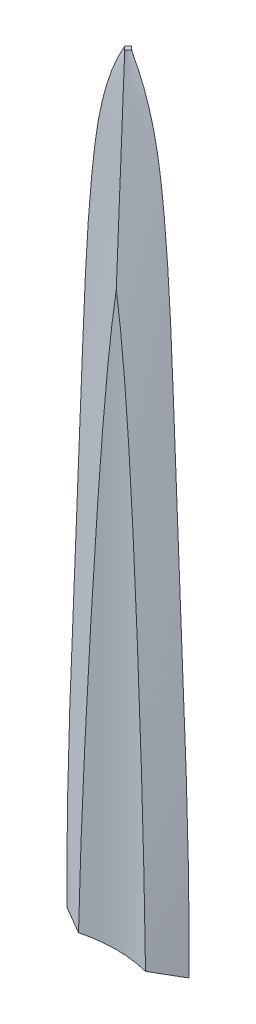
ISO-10303-21;
HEADER;
FILE_DESCRIPTION(('STEP AP214'),'2;1');
FILE_NAME('part.step','',(''),(''),'','','');
FILE_SCHEMA(('AUTOMOTIVE_DESIGN { 1 0 10303 214 1 1 1 1 }'));
ENDSEC;
DATA;
#1=APPLICATION_CONTEXT('core data for automotive mechanical design processes');
#2=APPLICATION_PROTOCOL_DEFINITION('international standard','automotive_design',2000,#1);
#3=PRODUCT_CONTEXT('',#1,'mechanical');
#4=PRODUCT('Part','Part','',(#3));
#5=PRODUCT_RELATED_PRODUCT_CATEGORY('part','',(#4));
#6=PRODUCT_DEFINITION_FORMATION('','',#4);
#7=PRODUCT_DEFINITION_CONTEXT('part definition',#1,'design');
#8=PRODUCT_DEFINITION('design','',#6,#7);
#9=PRODUCT_DEFINITION_SHAPE('','',#8);
#10=(LENGTH_UNIT() NAMED_UNIT(*) SI_UNIT(.MILLI.,.METRE.));
#11=(NAMED_UNIT(*) PLANE_ANGLE_UNIT() SI_UNIT($,.RADIAN.));
#12=(NAMED_UNIT(*) SI_UNIT($,.STERADIAN.) SOLID_ANGLE_UNIT());
#13=UNCERTAINTY_MEASURE_WITH_UNIT(LENGTH_MEASURE(1.E-05),#10,'distance_accuracy_value','');
#14=(GEOMETRIC_REPRESENTATION_CONTEXT(3) GLOBAL_UNCERTAINTY_ASSIGNED_CONTEXT((#13)) GLOBAL_UNIT_ASSIGNED_CONTEXT((#10,
#11,#12)) REPRESENTATION_CONTEXT('',''));
#15=CARTESIAN_POINT('',(0.,0.,0.));
#16=DIRECTION('',(0.,0.,1.));
#17=DIRECTION('',(1.,0.,0.));
#18=AXIS2_PLACEMENT_3D('',#15,#16,#17);
#19=CARTESIAN_POINT('',(0.,0.,0.));
#20=DIRECTION('',(0.,-1.,0.));
#21=DIRECTION('',(0.,0.,-1.));
#22=AXIS2_PLACEMENT_3D('',#19,#20,#21);
#23=PLANE('',#22);
#24=DIRECTION('',(0.863802262136864,0.,-0.503830975553545));
#25=VECTOR('',#24,1.);
#26=CARTESIAN_POINT('',(-18.7,0.,0.));
#27=LINE('',#26,#25);
#28=CARTESIAN_POINT('',(-18.7,0.,0.));
#29=VERTEX_POINT('',#28);
#30=CARTESIAN_POINT('',(-10.2868101095352,0.,-4.9071713004596));
#31=VERTEX_POINT('',#30);
#32=EDGE_CURVE('E157',#29,#31,#27,.T.);
#33=ORIENTED_EDGE('',*,*,#32,.T.);
#34=CARTESIAN_POINT('',(0.,0.,-44.7297123034199));
#35=DIRECTION('',(0.,1.,0.));
#36=DIRECTION('',(0.,0.,1.));
#37=AXIS2_PLACEMENT_3D('',#34,#35,#36);
#38=CIRCLE('',#37,41.1297123034199);
#39=CARTESIAN_POINT('',(10.2868101095352,0.,-4.90717130045959));
#40=VERTEX_POINT('',#39);
#41=EDGE_CURVE('E110',#31,#40,#38,.T.);
#42=ORIENTED_EDGE('',*,*,#41,.T.);
#43=DIRECTION('',(-0.863802262136864,0.,-0.503830975553545));
#44=VECTOR('',#43,1.);
#45=CARTESIAN_POINT('',(18.7,0.,0.));
#46=LINE('',#45,#44);
#47=CARTESIAN_POINT('',(18.7,0.,0.));
#48=VERTEX_POINT('',#47);
#49=EDGE_CURVE('E96',#48,#40,#46,.T.);
#50=ORIENTED_EDGE('',*,*,#49,.F.);
#51=DIRECTION('',(-0.863802262136864,0.,0.503830975553545));
#52=VECTOR('',#51,1.);
#53=CARTESIAN_POINT('',(18.7,0.,0.));
#54=LINE('',#53,#52);
#55=CARTESIAN_POINT('',(10.2868101095352,0.,4.9071713004596));
#56=VERTEX_POINT('',#55);
#57=EDGE_CURVE('E318',#48,#56,#54,.T.);
#58=ORIENTED_EDGE('',*,*,#57,.T.);
#59=CARTESIAN_POINT('',(0.,0.,44.7297123034199));
#60=DIRECTION('',(0.,1.,0.));
#61=DIRECTION('',(0.,0.,-1.));
#62=AXIS2_PLACEMENT_3D('',#59,#60,#61);
#63=CIRCLE('',#62,41.1297123034199);
#64=CARTESIAN_POINT('',(-10.2868101095352,0.,4.90717130045959));
#65=VERTEX_POINT('',#64);
#66=EDGE_CURVE('E117',#56,#65,#63,.T.);
#67=ORIENTED_EDGE('',*,*,#66,.T.);
#68=DIRECTION('',(0.863802262136864,0.,0.503830975553545));
#69=VECTOR('',#68,1.);
#70=CARTESIAN_POINT('',(-18.7,0.,0.));
#71=LINE('',#70,#69);
#72=EDGE_CURVE('E313',#29,#65,#71,.T.);
#73=ORIENTED_EDGE('',*,*,#72,.F.);
#74=EDGE_LOOP('',(#33,#42,#50,#58,#67,#73));
#75=FACE_BOUND('',#74,.T.);
#76=ADVANCED_FACE('F91',(#75),#23,.T.);
#77=CARTESIAN_POINT('',(18.7,0.,0.));
#78=CARTESIAN_POINT('',(19.028372503948,33.3846633972417,0.));
#79=CARTESIAN_POINT('',(16.5906953605792,83.30661577003,0.));
#80=CARTESIAN_POINT('',(14.0042695963335,150.071357034294,0.));
#81=CARTESIAN_POINT('',(12.1753977793605,196.268664067597,0.));
#82=CARTESIAN_POINT('',(7.71103709000424,226.376142788633,0.));
#83=CARTESIAN_POINT('',(1.00000000000003,238.,0.));
#84=CARTESIAN_POINT('',(12.4666666666667,0.,-3.63572376681987));
#85=CARTESIAN_POINT('',(12.6855816692987,33.3043704584423,-3.17583419904963));
#86=CARTESIAN_POINT('',(11.0604635737195,83.1595015027789,-2.48591920917832));
#87=CARTESIAN_POINT('',(9.33617973088902,149.774574066196,-1.56574925376783));
#88=CARTESIAN_POINT('',(8.11693185290702,195.969295005894,-0.92484201037589));
#89=CARTESIAN_POINT('',(5.14069139333616,225.911562468552,-0.513960189085018));
#90=CARTESIAN_POINT('',(0.666666666666686,238.,-0.333333333333333));
#91=CARTESIAN_POINT('',(6.23333333333333,0.,-7.27144753363973));
#92=CARTESIAN_POINT('',(6.34279083464934,33.2240775196429,-6.35166839809926));
#93=CARTESIAN_POINT('',(5.53023178685975,83.0123872355277,-4.97183841835665));
#94=CARTESIAN_POINT('',(4.66808986544451,149.477791098097,-3.13149850753566));
#95=CARTESIAN_POINT('',(4.05846592645351,195.669925944191,-1.84968402075178));
#96=CARTESIAN_POINT('',(2.57034569666808,225.44698214847,-1.02792037817004));
#97=CARTESIAN_POINT('',(0.333333333333343,238.,-0.666666666666667));
#98=CARTESIAN_POINT('',(0.,0.,-10.9071713004596));
#99=CARTESIAN_POINT('',(0.,33.1437845808435,-9.52750259714889));
#100=CARTESIAN_POINT('',(0.,82.8652729682766,-7.45775762753497));
#101=CARTESIAN_POINT('',(0.,149.181008129999,-4.69724776130349));
#102=CARTESIAN_POINT('',(0.,195.370556882488,-2.77452603112767));
#103=CARTESIAN_POINT('',(0.,224.982401828389,-1.54188056725505));
#104=CARTESIAN_POINT('',(0.,238.,-1.));
#105=B_SPLINE_SURFACE_WITH_KNOTS('',3,3,((#77,#78,#79,#80,#81,#82,#83),(#84,#85,#86,#87,#88,#89,
#90),(#91,#92,#93,#94,#95,#96,#97),(#98,#99,#100,#101,#102,#103,#104)),.UNSPECIFIED.,.F.,.F.,
.F.,(4,4),(4,1,1,1,4),(0.,1.),(0.,0.417778797237524,0.626741450261761,0.835912628088933,1.),.UNSPECIFIED.);
#106=CARTESIAN_POINT('',(10.2868101095352,0.,-4.90717130045959));
#107=CARTESIAN_POINT('',(10.2536082102317,1.80397180112922,-4.89859513866021));
#108=CARTESIAN_POINT('',(10.2174728662394,3.60788407690856,-4.8893046046317));
#109=CARTESIAN_POINT('',(10.1396995857272,7.21558035530268,-4.86943953827193));
#110=CARTESIAN_POINT('',(10.0980616576915,9.01936435811095,-4.85886500792044));
#111=CARTESIAN_POINT('',(9.96544113580844,14.4304832685712,-4.82543271511151));
#112=CARTESIAN_POINT('',(9.8667511420441,18.0376202824057,-4.80086607788973));
#113=CARTESIAN_POINT('',(9.65132828397124,25.2509363567552,-4.74824935566302));
#114=CARTESIAN_POINT('',(9.53459735376291,28.8571154784977,-4.72019964412853));
#115=CARTESIAN_POINT('',(9.28519388773787,36.0689105755034,-4.6615851731005));
#116=CARTESIAN_POINT('',(9.15252130628881,39.6745265491252,-4.6310204064078));
#117=CARTESIAN_POINT('',(8.91959894866971,45.6833435848287,-4.57870839063558));
#118=CARTESIAN_POINT('',(8.82328404788901,48.0867024790972,-4.55741827686631));
#119=CARTESIAN_POINT('',(8.62480595036751,52.8931714256303,-4.51433879283749));
#120=CARTESIAN_POINT('',(8.52264276082298,55.2962814781974,-4.4925494231923));
#121=CARTESIAN_POINT('',(8.31285810340028,60.1022579653933,-4.44868564054428));
#122=CARTESIAN_POINT('',(8.20523664086767,62.5051244002584,-4.42661122782063));
#123=CARTESIAN_POINT('',(7.98484734971606,67.3107850654576,-4.38236938131768));
#124=CARTESIAN_POINT('',(7.87207916932664,69.7135792795905,-4.36020194127442));
#125=CARTESIAN_POINT('',(7.64164397390511,74.518935366288,-4.3159488343847));
#126=CARTESIAN_POINT('',(7.52397695483401,76.9214972386594,-4.29386316760569));
#127=CARTESIAN_POINT('',(7.28388898364138,81.7263924824993,-4.2499260960168));
#128=CARTESIAN_POINT('',(7.16146801796697,84.1287258532967,-4.22807469187502));
#129=CARTESIAN_POINT('',(6.94021308734141,88.388066085935,-4.18965477073385));
#130=CARTESIAN_POINT('',(6.84233019823456,90.2451217434726,-4.1730125982855));
#131=CARTESIAN_POINT('',(6.64367944776966,93.9590800303901,-4.13999816002834));
#132=CARTESIAN_POINT('',(6.54291158826197,95.8159826598674,-4.12362589404643));
#133=CARTESIAN_POINT('',(6.3384036278846,99.5296195251148,-4.09120101577371));
#134=CARTESIAN_POINT('',(6.23466353915421,101.386353761542,-4.07514840217783));
#135=CARTESIAN_POINT('',(6.02383277408636,105.099622360246,-4.04337502458788));
#136=CARTESIAN_POINT('',(5.91674212074716,106.956156723808,-4.02765425831725));
#137=CARTESIAN_POINT('',(5.69866304633141,110.668753365799,-3.99654885650352));
#138=CARTESIAN_POINT('',(5.5876751425645,112.524815674191,-3.98116417678573));
#139=CARTESIAN_POINT('',(5.36116683066352,116.236670275977,-3.95074485344855));
#140=CARTESIAN_POINT('',(5.24564641491024,118.092462568912,-3.93571021041763));
#141=CARTESIAN_POINT('',(5.00933284356304,121.803741525314,-3.90601817154265));
#142=CARTESIAN_POINT('',(4.88853961326842,123.659228184076,-3.89136078104785));
#143=CARTESIAN_POINT('',(4.6408019442922,127.369852205581,-3.86246679518203));
#144=CARTESIAN_POINT('',(4.51385731842899,129.224989555969,-3.84823021263708));
#145=CARTESIAN_POINT('',(4.2787517023373,132.565384828332,-3.82303112020536));
#146=CARTESIAN_POINT('',(4.17188424444768,134.05073305353,-3.8119811800615));
#147=CARTESIAN_POINT('',(3.95286199122932,137.0210473897,-3.79024193995584));
#148=CARTESIAN_POINT('',(3.84070718114164,138.506013499594,-3.77955264100086));
#149=CARTESIAN_POINT('',(3.61032941353176,141.475442966633,-3.75859884149729));
#150=CARTESIAN_POINT('',(3.49210660287036,142.95990633507,-3.74833433067861));
#151=CARTESIAN_POINT('',(3.24864218443762,145.928196596996,-3.7283162170066));
#152=CARTESIAN_POINT('',(3.12340088635864,147.412023515661,-3.71856259164702));
#153=CARTESIAN_POINT('',(2.86473783393212,150.378891356726,-3.69968253005154));
#154=CARTESIAN_POINT('',(2.73131651393271,151.861932316649,-3.69055606056898));
#155=CARTESIAN_POINT('',(2.45457591019681,154.82777793228,-3.6730741549155));
#156=CARTESIAN_POINT('',(2.31125216491514,156.310582175775,-3.66471907030574));
#157=CARTESIAN_POINT('',(2.0128072928957,159.275009333752,-3.64900907924145));
#158=CARTESIAN_POINT('',(1.85768619227719,160.756632250841,-3.64165417057264));
#159=CARTESIAN_POINT('',(1.5332924676776,163.718424277383,-3.62826867124131));
#160=CARTESIAN_POINT('',(1.36401912081792,165.198593308662,-3.62223814828386));
#161=CARTESIAN_POINT('',(1.09725360218455,167.417424444137,-3.61454311979214));
#162=CARTESIAN_POINT('',(1.00618122787232,168.156857999907,-3.61220310054522));
#163=CARTESIAN_POINT('',(0.819291388107683,169.635125029391,-3.60805452131246));
#164=CARTESIAN_POINT('',(0.723473942478938,170.3739585056,-3.60624595910655));
#165=CARTESIAN_POINT('',(0.526546093706454,171.851183865984,-3.60325228557918));
#166=CARTESIAN_POINT('',(0.425433866152131,172.589575508094,-3.60206739072827));
#167=CARTESIAN_POINT('',(0.217305052355414,174.065537139107,-3.60044368673681));
#168=CARTESIAN_POINT('',(0.110288379741057,174.803107115828,-3.60000488851337));
#169=CARTESIAN_POINT('',(0.,175.540193741145,-3.6));
#170=B_SPLINE_CURVE_WITH_KNOTS('',3,(#106,#107,#108,#109,#110,#111,#112,#113,#114,#115,#116,
#117,#118,#119,#120,#121,#122,#123,#124,#125,#126,#127,#128,#129,#130,#131,#132,#133,#134,#135,
#136,#137,#138,#139,#140,#141,#142,#143,#144,#145,#146,#147,#148,#149,#150,#151,#152,#153,#154,
#155,#156,#157,#158,#159,#160,#161,#162,#163,#164,#165,#166,#167,#168,#169),.UNSPECIFIED.,.F.,
.F.,(4,2,2,2,2,2,2,2,2,2,2,2,2,2,2,2,2,2,2,2,2,2,2,2,2,2,2,2,2,2,2,4),(0.,5.41288701557873,
10.8257656852417,21.6514173939201,32.4759093296633,43.3004322508269,50.5165723637034,
57.7327035973769,64.9488277640789,72.1654458827771,79.3820699515353,86.59871459547,
92.177836415115,97.7569546564837,103.336050114624,108.915107286255,114.493426688891,
120.071755469136,125.650163303988,131.228740991641,135.696419052973,140.164109585962,
144.6316920406,149.099077517135,153.566225986622,158.035400425985,162.504564970916,
166.973957934674,169.209019003294,171.444070735202,173.679897727124,175.915757434058),.UNSPECIFIED.);
#171=CARTESIAN_POINT('',(0.,175.540193741144,-3.6));
#172=VERTEX_POINT('',#171);
#173=EDGE_CURVE('E145',#40,#172,#170,.T.);
#174=CARTESIAN_POINT('',(0.,0.,-10.9071713004596));
#175=CARTESIAN_POINT('',(0.,33.1437845808435,-9.52750259714889));
#176=CARTESIAN_POINT('',(0.,82.8652729682766,-7.45775762753497));
#177=CARTESIAN_POINT('',(0.,149.181008129999,-4.69724776130349));
#178=CARTESIAN_POINT('',(0.,195.370556882488,-2.77452603112767));
#179=CARTESIAN_POINT('',(0.,224.982401828389,-1.54188056725505));
#180=CARTESIAN_POINT('',(0.,238.,-1.));
#181=B_SPLINE_CURVE_WITH_KNOTS('',3,(#174,#175,#176,#177,#178,#179,#180),.UNSPECIFIED.,.F.,.F.,
(4,1,1,1,4),(0.,0.417778797237524,0.626741450261761,0.835912628088933,1.),.UNSPECIFIED.);
#182=CARTESIAN_POINT('',(0.,238.,-1.));
#183=VERTEX_POINT('',#182);
#184=EDGE_CURVE('E167',#172,#183,#181,.T.);
#185=DIRECTION('',(0.707106781186558,0.,0.707106781186537));
#186=VECTOR('',#185,1.);
#187=CARTESIAN_POINT('',(0.,238.,-1.));
#188=LINE('',#187,#186);
#189=CARTESIAN_POINT('',(1.00000000000003,238.,0.));
#190=VERTEX_POINT('',#189);
#191=EDGE_CURVE('E224',#183,#190,#188,.T.);
#192=CARTESIAN_POINT('',(1.00000000000003,238.,0.));
#193=CARTESIAN_POINT('',(7.71103709000424,226.376142788633,0.));
#194=CARTESIAN_POINT('',(12.1753977793605,196.268664067597,0.));
#195=CARTESIAN_POINT('',(14.0042695963335,150.071357034294,0.));
#196=CARTESIAN_POINT('',(16.5906953605792,83.30661577003,0.));
#197=CARTESIAN_POINT('',(19.028372503948,33.3846633972417,0.));
#198=CARTESIAN_POINT('',(18.7,0.,0.));
#199=B_SPLINE_CURVE_WITH_KNOTS('',3,(#192,#193,#194,#195,#196,#197,#198),.UNSPECIFIED.,.F.,.F.,
(4,1,1,1,4),(0.,0.164087371911067,0.373258549738239,0.582221202762476,1.),.UNSPECIFIED.);
#200=EDGE_CURVE('E163',#190,#48,#199,.T.);
#201=ORIENTED_EDGE('',*,*,#49,.T.);
#202=ORIENTED_EDGE('',*,*,#173,.T.);
#203=ORIENTED_EDGE('',*,*,#184,.T.);
#204=ORIENTED_EDGE('',*,*,#191,.T.);
#205=ORIENTED_EDGE('',*,*,#200,.T.);
#206=EDGE_LOOP('',(#201,#202,#203,#204,#205));
#207=FACE_BOUND('',#206,.T.);
#208=ADVANCED_FACE('F161',(#207),#105,.T.);
#209=CARTESIAN_POINT('',(-18.7,0.,0.));
#210=CARTESIAN_POINT('',(-19.028372503948,33.3846633972417,0.));
#211=CARTESIAN_POINT('',(-16.5906953605792,83.30661577003,0.));
#212=CARTESIAN_POINT('',(-14.0042695963335,150.071357034294,0.));
#213=CARTESIAN_POINT('',(-12.1753977793605,196.268664067597,0.));
#214=CARTESIAN_POINT('',(-7.71103709000424,226.376142788633,0.));
#215=CARTESIAN_POINT('',(-1.00000000000003,238.,0.));
#216=CARTESIAN_POINT('',(-12.4666666666667,0.,-3.63572376681987));
#217=CARTESIAN_POINT('',(-12.6855816692987,33.3043704584423,-3.17583419904963));
#218=CARTESIAN_POINT('',(-11.0604635737195,83.1595015027789,-2.48591920917832));
#219=CARTESIAN_POINT('',(-9.33617973088902,149.774574066196,-1.56574925376783));
#220=CARTESIAN_POINT('',(-8.11693185290702,195.969295005894,-0.92484201037589));
#221=CARTESIAN_POINT('',(-5.14069139333616,225.911562468552,-0.513960189085018));
#222=CARTESIAN_POINT('',(-0.666666666666686,238.,-0.333333333333333));
#223=CARTESIAN_POINT('',(-6.23333333333333,0.,-7.27144753363973));
#224=CARTESIAN_POINT('',(-6.34279083464934,33.2240775196429,-6.35166839809926));
#225=CARTESIAN_POINT('',(-5.53023178685975,83.0123872355277,-4.97183841835665));
#226=CARTESIAN_POINT('',(-4.66808986544451,149.477791098097,-3.13149850753566));
#227=CARTESIAN_POINT('',(-4.05846592645351,195.669925944191,-1.84968402075178));
#228=CARTESIAN_POINT('',(-2.57034569666808,225.44698214847,-1.02792037817004));
#229=CARTESIAN_POINT('',(-0.333333333333343,238.,-0.666666666666667));
#230=CARTESIAN_POINT('',(0.,0.,-10.9071713004596));
#231=CARTESIAN_POINT('',(0.,33.1437845808435,-9.52750259714889));
#232=CARTESIAN_POINT('',(0.,82.8652729682766,-7.45775762753497));
#233=CARTESIAN_POINT('',(0.,149.181008129999,-4.69724776130349));
#234=CARTESIAN_POINT('',(0.,195.370556882488,-2.77452603112767));
#235=CARTESIAN_POINT('',(0.,224.982401828389,-1.54188056725505));
#236=CARTESIAN_POINT('',(0.,238.,-1.));
#237=B_SPLINE_SURFACE_WITH_KNOTS('',3,3,((#209,#210,#211,#212,#213,#214,#215),(#216,#217,#218,
#219,#220,#221,#222),(#223,#224,#225,#226,#227,#228,#229),(#230,#231,#232,#233,#234,#235,#236)),
.UNSPECIFIED.,.F.,.F.,.F.,(4,4),(4,1,1,1,4),(0.,1.),(0.,0.417778797237524,0.626741450261761,
0.835912628088933,1.),.UNSPECIFIED.);
#238=CARTESIAN_POINT('',(0.,175.540193741144,-3.6));
#239=CARTESIAN_POINT('',(-0.107014495973239,174.824998845238,-3.60000436486476));
#240=CARTESIAN_POINT('',(-0.210946621781463,174.109348272951,-3.60041773375725));
#241=CARTESIAN_POINT('',(-0.41323357473325,172.67726919762,-3.60195042338045));
#242=CARTESIAN_POINT('',(-0.511588477727015,171.96084070529,-3.60306973450782));
#243=CARTESIAN_POINT('',(-0.703279398518364,170.52755832223,-3.60590178719363));
#244=CARTESIAN_POINT('',(-0.796617075964363,169.810704652468,-3.60761433110364));
#245=CARTESIAN_POINT('',(-0.97878378970676,168.376424591824,-3.61154709266807));
#246=CARTESIAN_POINT('',(-1.06761280850233,167.658998198731,-3.6137673122929));
#247=CARTESIAN_POINT('',(-1.32795362777723,165.506206349897,-3.62107570605014));
#248=CARTESIAN_POINT('',(-1.49334922226805,164.070101541573,-3.62681211220914));
#249=CARTESIAN_POINT('',(-1.81059021240397,161.196487522911,-3.6395658248143));
#250=CARTESIAN_POINT('',(-1.96243629029226,159.758978386971,-3.64658306671377));
#251=CARTESIAN_POINT('',(-2.25478010819869,156.882813272791,-3.661590651922));
#252=CARTESIAN_POINT('',(-2.39527782875797,155.444157292587,-3.66958099689926));
#253=CARTESIAN_POINT('',(-2.66668316107451,152.566609215802,-3.68631452717943));
#254=CARTESIAN_POINT('',(-2.79759510215848,151.127717523661,-3.69505736869436));
#255=CARTESIAN_POINT('',(-3.05147415716727,148.249165257981,-3.71315563559527));
#256=CARTESIAN_POINT('',(-3.17444086285528,146.80950464876,-3.7225110924086));
#257=CARTESIAN_POINT('',(-3.41356048002847,143.929560425882,-3.74172356432451));
#258=CARTESIAN_POINT('',(-3.5297130989683,142.489276788146,-3.75158060092726));
#259=CARTESIAN_POINT('',(-3.75610626426427,139.608214771951,-3.77171172683471));
#260=CARTESIAN_POINT('',(-3.86634667106269,138.16743638262,-3.78198582597414));
#261=CARTESIAN_POINT('',(-4.08166462685158,135.285501312085,-3.80288807640913));
#262=CARTESIAN_POINT('',(-4.18674218990781,133.844344631922,-3.81351622673998));
#263=CARTESIAN_POINT('',(-4.41791715118025,130.603536740128,-3.83775818188752));
#264=CARTESIAN_POINT('',(-4.54274905709678,128.803795972017,-3.85145759894689));
#265=CARTESIAN_POINT('',(-4.78637299419522,125.203963860525,-3.87926691789331));
#266=CARTESIAN_POINT('',(-4.90516520456043,123.403872529135,-3.89337680758307));
#267=CARTESIAN_POINT('',(-5.13755559618792,119.803383185577,-3.92196230883895));
#268=CARTESIAN_POINT('',(-5.25115384923138,118.002985177992,-3.93643791534653));
#269=CARTESIAN_POINT('',(-5.47386777520561,114.401918447003,-3.96572553220879));
#270=CARTESIAN_POINT('',(-5.58298345610278,112.601249724087,-3.98053754196555));
#271=CARTESIAN_POINT('',(-5.79735171858177,108.9994434215,-4.01048271103554));
#272=CARTESIAN_POINT('',(-5.90260378093489,107.198305811335,-4.0256159130854));
#273=CARTESIAN_POINT('',(-6.10974801860962,103.595828340555,-4.0561929699428));
#274=CARTESIAN_POINT('',(-6.21164017158272,101.794488478675,-4.07163682681556));
#275=CARTESIAN_POINT('',(-6.41252763685726,98.1916426353137,-4.1028363819171));
#276=CARTESIAN_POINT('',(-6.51152293721159,96.3901366531776,-4.11859208143151));
#277=CARTESIAN_POINT('',(-6.70676517681741,92.7869769326747,-4.15037867778601));
#278=CARTESIAN_POINT('',(-6.80301211400573,90.9853231941981,-4.16640957483267));
#279=CARTESIAN_POINT('',(-7.028324373164,86.7080450051112,-4.20473989740857));
#280=CARTESIAN_POINT('',(-7.15620141551144,84.2323587932899,-4.22714145589144));
#281=CARTESIAN_POINT('',(-7.40693332110752,79.2807420340473,-4.27224335790311));
#282=CARTESIAN_POINT('',(-7.52978819883464,76.8048114873509,-4.29494370057029));
#283=CARTESIAN_POINT('',(-7.77035436132436,71.8527037071687,-4.34048339137808));
#284=CARTESIAN_POINT('',(-7.88806565037113,69.37652647389,-4.3633227394029));
#285=CARTESIAN_POINT('',(-8.11810182459439,64.4240952161566,-4.40895580679125));
#286=CARTESIAN_POINT('',(-8.23042708679706,61.9478412092544,-4.43174952924127));
#287=CARTESIAN_POINT('',(-8.44937155555761,56.9950757947376,-4.47708691153447));
#288=CARTESIAN_POINT('',(-8.55599075649875,54.5185643868721,-4.49963057113149));
#289=CARTESIAN_POINT('',(-8.763112823812,49.565278354457,-4.54423840234321));
#290=CARTESIAN_POINT('',(-8.86361568218591,47.0885037295674,-4.56630257333087));
#291=CARTESIAN_POINT('',(-9.10666710692844,40.8953655199913,-4.62055918211995));
#292=CARTESIAN_POINT('',(-9.24509232779424,37.1788346965755,-4.65229552774063));
#293=CARTESIAN_POINT('',(-9.50519541660488,29.7451753536871,-4.71318644827));
#294=CARTESIAN_POINT('',(-9.6268733357243,26.0280468360756,-4.74234103106767));
#295=CARTESIAN_POINT('',(-9.85121368133558,18.592776296251,-4.79701686654884));
#296=CARTESIAN_POINT('',(-9.95387403455265,14.8746342077382,-4.82253772301728));
#297=CARTESIAN_POINT('',(-10.0915542503082,9.29697996446715,-4.85721541804234));
#298=CARTESIAN_POINT('',(-10.1347294523962,7.43767867361919,-4.86817409916086));
#299=CARTESIAN_POINT('',(-10.2152452126443,3.71893936477921,-4.88873192898459));
#300=CARTESIAN_POINT('',(-10.2525857610482,1.85950134656377,-4.89833107541648));
#301=CARTESIAN_POINT('',(-10.2868101095352,0.,-4.90717130045959));
#302=B_SPLINE_CURVE_WITH_KNOTS('',3,(#238,#239,#240,#241,#242,#243,#244,#245,#246,#247,#248,
#249,#250,#251,#252,#253,#254,#255,#256,#257,#258,#259,#260,#261,#262,#263,#264,#265,#266,#267,
#268,#269,#270,#271,#272,#273,#274,#275,#276,#277,#278,#279,#280,#281,#282,#283,#284,#285,#286,
#287,#288,#289,#290,#291,#292,#293,#294,#295,#296,#297,#298,#299,#300,#301),.UNSPECIFIED.,.F.,
.F.,(4,2,2,2,2,2,2,2,2,2,2,2,2,2,2,2,2,2,2,2,2,2,2,2,2,2,2,2,2,2,2,4),(0.,2.16945573845242,
4.33888196523844,6.50758609450541,8.67629864117826,13.0130377858978,17.3495584444335,
21.6860865385825,26.0206438434502,30.3554236868517,34.6903894969338,39.0254575888536,
43.3605138695588,48.7728518348939,54.1850291353121,59.597131616103,65.0092244781083,
70.4220420239928,75.8348955661049,81.2477714286371,86.6606513544738,94.097909537302,
101.535146277607,108.972376823193,116.409085994378,123.845802485721,131.28252870166,
142.440222479788,153.597882162705,164.756757526865,170.336253366989,175.915758536673),.UNSPECIFIED.);
#303=EDGE_CURVE('E13',#172,#31,#302,.T.);
#304=CARTESIAN_POINT('',(-1.00000000000003,238.,0.));
#305=CARTESIAN_POINT('',(-7.71103709000424,226.376142788633,0.));
#306=CARTESIAN_POINT('',(-12.1753977793605,196.268664067597,0.));
#307=CARTESIAN_POINT('',(-14.0042695963335,150.071357034294,0.));
#308=CARTESIAN_POINT('',(-16.5906953605792,83.30661577003,0.));
#309=CARTESIAN_POINT('',(-19.028372503948,33.3846633972417,0.));
#310=CARTESIAN_POINT('',(-18.7,0.,0.));
#311=B_SPLINE_CURVE_WITH_KNOTS('',3,(#304,#305,#306,#307,#308,#309,#310),.UNSPECIFIED.,.F.,.F.,
(4,1,1,1,4),(0.,0.164087371911067,0.373258549738239,0.582221202762476,1.),.UNSPECIFIED.);
#312=CARTESIAN_POINT('',(-1.00000000000003,238.,0.));
#313=VERTEX_POINT('',#312);
#314=EDGE_CURVE('E317',#313,#29,#311,.T.);
#315=DIRECTION('',(-0.707106781186558,0.,0.707106781186537));
#316=VECTOR('',#315,1.);
#317=CARTESIAN_POINT('',(0.,238.,-1.));
#318=LINE('',#317,#316);
#319=EDGE_CURVE('E230',#183,#313,#318,.T.);
#320=ORIENTED_EDGE('',*,*,#184,.F.);
#321=ORIENTED_EDGE('',*,*,#303,.T.);
#322=ORIENTED_EDGE('',*,*,#32,.F.);
#323=ORIENTED_EDGE('',*,*,#314,.F.);
#324=ORIENTED_EDGE('',*,*,#319,.F.);
#325=EDGE_LOOP('',(#320,#321,#322,#323,#324));
#326=FACE_BOUND('',#325,.T.);
#327=ADVANCED_FACE('F189',(#326),#237,.F.);
#328=CARTESIAN_POINT('',(-18.7,0.,0.));
#329=CARTESIAN_POINT('',(-19.028372503948,33.3846633972417,0.));
#330=CARTESIAN_POINT('',(-16.5906953605792,83.30661577003,0.));
#331=CARTESIAN_POINT('',(-14.0042695963335,150.071357034294,0.));
#332=CARTESIAN_POINT('',(-12.1753977793605,196.268664067597,0.));
#333=CARTESIAN_POINT('',(-7.71103709000424,226.376142788633,0.));
#334=CARTESIAN_POINT('',(-1.00000000000003,238.,0.));
#335=CARTESIAN_POINT('',(-12.4666666666667,0.,3.63572376681987));
#336=CARTESIAN_POINT('',(-12.6855816692987,33.3043704584423,3.17583419904963));
#337=CARTESIAN_POINT('',(-11.0604635737195,83.1595015027789,2.48591920917832));
#338=CARTESIAN_POINT('',(-9.33617973088902,149.774574066196,1.56574925376783));
#339=CARTESIAN_POINT('',(-8.11693185290702,195.969295005894,0.92484201037589));
#340=CARTESIAN_POINT('',(-5.14069139333616,225.911562468552,0.513960189085018));
#341=CARTESIAN_POINT('',(-0.666666666666686,238.,0.333333333333333));
#342=CARTESIAN_POINT('',(-6.23333333333333,0.,7.27144753363973));
#343=CARTESIAN_POINT('',(-6.34279083464934,33.2240775196429,6.35166839809926));
#344=CARTESIAN_POINT('',(-5.53023178685975,83.0123872355277,4.97183841835665));
#345=CARTESIAN_POINT('',(-4.66808986544451,149.477791098097,3.13149850753566));
#346=CARTESIAN_POINT('',(-4.05846592645351,195.669925944191,1.84968402075178));
#347=CARTESIAN_POINT('',(-2.57034569666808,225.44698214847,1.02792037817004));
#348=CARTESIAN_POINT('',(-0.333333333333343,238.,0.666666666666667));
#349=CARTESIAN_POINT('',(0.,0.,10.9071713004596));
#350=CARTESIAN_POINT('',(0.,33.1437845808435,9.52750259714889));
#351=CARTESIAN_POINT('',(0.,82.8652729682766,7.45775762753497));
#352=CARTESIAN_POINT('',(0.,149.181008129999,4.69724776130349));
#353=CARTESIAN_POINT('',(0.,195.370556882488,2.77452603112767));
#354=CARTESIAN_POINT('',(0.,224.982401828389,1.54188056725505));
#355=CARTESIAN_POINT('',(0.,238.,1.));
#356=B_SPLINE_SURFACE_WITH_KNOTS('',3,3,((#328,#329,#330,#331,#332,#333,#334),(#335,#336,#337,
#338,#339,#340,#341),(#342,#343,#344,#345,#346,#347,#348),(#349,#350,#351,#352,#353,#354,#355)),
.UNSPECIFIED.,.F.,.F.,.F.,(4,4),(4,1,1,1,4),(0.,1.),(0.,0.417778797237524,0.626741450261761,
0.835912628088933,1.),.UNSPECIFIED.);
#357=CARTESIAN_POINT('',(-10.2868101095352,0.,4.90717130045959));
#358=CARTESIAN_POINT('',(-10.2536082102317,1.80397180112922,4.89859513866021));
#359=CARTESIAN_POINT('',(-10.2174728662394,3.60788407690856,4.8893046046317));
#360=CARTESIAN_POINT('',(-10.1396995857272,7.21558035530268,4.86943953827193));
#361=CARTESIAN_POINT('',(-10.0980616576915,9.01936435811095,4.85886500792044));
#362=CARTESIAN_POINT('',(-9.96544113580844,14.4304832685712,4.82543271511151));
#363=CARTESIAN_POINT('',(-9.8667511420441,18.0376202824057,4.80086607788973));
#364=CARTESIAN_POINT('',(-9.65132828397124,25.2509363567552,4.74824935566302));
#365=CARTESIAN_POINT('',(-9.53459735376291,28.8571154784977,4.72019964412853));
#366=CARTESIAN_POINT('',(-9.28519388773787,36.0689105755034,4.6615851731005));
#367=CARTESIAN_POINT('',(-9.15252130628881,39.6745265491252,4.6310204064078));
#368=CARTESIAN_POINT('',(-8.91959894866971,45.6833435848287,4.57870839063558));
#369=CARTESIAN_POINT('',(-8.82328404788901,48.0867024790972,4.55741827686631));
#370=CARTESIAN_POINT('',(-8.62480595036751,52.8931714256303,4.51433879283749));
#371=CARTESIAN_POINT('',(-8.52264276082298,55.2962814781974,4.4925494231923));
#372=CARTESIAN_POINT('',(-8.31285810340028,60.1022579653933,4.44868564054428));
#373=CARTESIAN_POINT('',(-8.20523664086767,62.5051244002584,4.42661122782063));
#374=CARTESIAN_POINT('',(-7.98484734971606,67.3107850654576,4.38236938131768));
#375=CARTESIAN_POINT('',(-7.87207916932664,69.7135792795905,4.36020194127442));
#376=CARTESIAN_POINT('',(-7.64164397390511,74.518935366288,4.3159488343847));
#377=CARTESIAN_POINT('',(-7.52397695483401,76.9214972386594,4.29386316760569));
#378=CARTESIAN_POINT('',(-7.28388898364138,81.7263924824993,4.2499260960168));
#379=CARTESIAN_POINT('',(-7.16146801796697,84.1287258532967,4.22807469187502));
#380=CARTESIAN_POINT('',(-6.94021308734141,88.388066085935,4.18965477073385));
#381=CARTESIAN_POINT('',(-6.84233019823456,90.2451217434726,4.1730125982855));
#382=CARTESIAN_POINT('',(-6.64367944776966,93.9590800303901,4.13999816002834));
#383=CARTESIAN_POINT('',(-6.54291158826197,95.8159826598674,4.12362589404643));
#384=CARTESIAN_POINT('',(-6.3384036278846,99.5296195251148,4.09120101577371));
#385=CARTESIAN_POINT('',(-6.23466353915421,101.386353761542,4.07514840217783));
#386=CARTESIAN_POINT('',(-6.02383277408636,105.099622360246,4.04337502458788));
#387=CARTESIAN_POINT('',(-5.91674212074716,106.956156723808,4.02765425831725));
#388=CARTESIAN_POINT('',(-5.69866304633141,110.668753365799,3.99654885650352));
#389=CARTESIAN_POINT('',(-5.5876751425645,112.524815674191,3.98116417678573));
#390=CARTESIAN_POINT('',(-5.36116683066352,116.236670275977,3.95074485344855));
#391=CARTESIAN_POINT('',(-5.24564641491024,118.092462568912,3.93571021041763));
#392=CARTESIAN_POINT('',(-5.00933284356304,121.803741525314,3.90601817154265));
#393=CARTESIAN_POINT('',(-4.88853961326842,123.659228184076,3.89136078104785));
#394=CARTESIAN_POINT('',(-4.6408019442922,127.369852205581,3.86246679518203));
#395=CARTESIAN_POINT('',(-4.51385731842899,129.224989555969,3.84823021263708));
#396=CARTESIAN_POINT('',(-4.2787517023373,132.565384828332,3.82303112020536));
#397=CARTESIAN_POINT('',(-4.17188424444768,134.05073305353,3.8119811800615));
#398=CARTESIAN_POINT('',(-3.95286199122932,137.0210473897,3.79024193995584));
#399=CARTESIAN_POINT('',(-3.84070718114164,138.506013499594,3.77955264100086));
#400=CARTESIAN_POINT('',(-3.61032941353176,141.475442966633,3.75859884149729));
#401=CARTESIAN_POINT('',(-3.49210660287036,142.95990633507,3.74833433067861));
#402=CARTESIAN_POINT('',(-3.24864218443762,145.928196596996,3.7283162170066));
#403=CARTESIAN_POINT('',(-3.12340088635864,147.412023515661,3.71856259164702));
#404=CARTESIAN_POINT('',(-2.86473783393212,150.378891356726,3.69968253005154));
#405=CARTESIAN_POINT('',(-2.73131651393271,151.861932316649,3.69055606056898));
#406=CARTESIAN_POINT('',(-2.45457591019681,154.82777793228,3.6730741549155));
#407=CARTESIAN_POINT('',(-2.31125216491514,156.310582175775,3.66471907030574));
#408=CARTESIAN_POINT('',(-2.0128072928957,159.275009333752,3.64900907924145));
#409=CARTESIAN_POINT('',(-1.85768619227719,160.756632250841,3.64165417057264));
#410=CARTESIAN_POINT('',(-1.5332924676776,163.718424277383,3.62826867124131));
#411=CARTESIAN_POINT('',(-1.36401912081792,165.198593308662,3.62223814828386));
#412=CARTESIAN_POINT('',(-1.09725360218455,167.417424444137,3.61454311979214));
#413=CARTESIAN_POINT('',(-1.00618122787232,168.156857999907,3.61220310054522));
#414=CARTESIAN_POINT('',(-0.819291388107683,169.635125029391,3.60805452131246));
#415=CARTESIAN_POINT('',(-0.723473942478938,170.3739585056,3.60624595910655));
#416=CARTESIAN_POINT('',(-0.526546093706454,171.851183865984,3.60325228557918));
#417=CARTESIAN_POINT('',(-0.425433866152131,172.589575508094,3.60206739072827));
#418=CARTESIAN_POINT('',(-0.217305052355414,174.065537139107,3.60044368673681));
#419=CARTESIAN_POINT('',(-0.110288379741057,174.803107115828,3.60000488851337));
#420=CARTESIAN_POINT('',(0.,175.540193741145,3.6));
#421=B_SPLINE_CURVE_WITH_KNOTS('',3,(#357,#358,#359,#360,#361,#362,#363,#364,#365,#366,#367,
#368,#369,#370,#371,#372,#373,#374,#375,#376,#377,#378,#379,#380,#381,#382,#383,#384,#385,#386,
#387,#388,#389,#390,#391,#392,#393,#394,#395,#396,#397,#398,#399,#400,#401,#402,#403,#404,#405,
#406,#407,#408,#409,#410,#411,#412,#413,#414,#415,#416,#417,#418,#419,#420),.UNSPECIFIED.,.F.,
.F.,(4,2,2,2,2,2,2,2,2,2,2,2,2,2,2,2,2,2,2,2,2,2,2,2,2,2,2,2,2,2,2,4),(0.,5.41288701557873,
10.8257656852417,21.6514173939201,32.4759093296633,43.3004322508269,50.5165723637034,
57.7327035973769,64.9488277640789,72.1654458827771,79.3820699515353,86.59871459547,
92.177836415115,97.7569546564837,103.336050114624,108.915107286255,114.493426688891,
120.071755469136,125.650163303988,131.228740991641,135.696419052973,140.164109585962,
144.6316920406,149.099077517135,153.566225986622,158.035400425985,162.504564970916,
166.973957934674,169.209019003294,171.444070735202,173.679897727124,175.915757434058),.UNSPECIFIED.);
#422=CARTESIAN_POINT('',(0.,175.540193741144,3.6));
#423=VERTEX_POINT('',#422);
#424=EDGE_CURVE('E234',#65,#423,#421,.T.);
#425=CARTESIAN_POINT('',(0.,0.,10.9071713004596));
#426=CARTESIAN_POINT('',(0.,33.1437845808435,9.52750259714889));
#427=CARTESIAN_POINT('',(0.,82.8652729682766,7.45775762753497));
#428=CARTESIAN_POINT('',(0.,149.181008129999,4.69724776130349));
#429=CARTESIAN_POINT('',(0.,195.370556882488,2.77452603112767));
#430=CARTESIAN_POINT('',(0.,224.982401828389,1.54188056725505));
#431=CARTESIAN_POINT('',(0.,238.,1.));
#432=B_SPLINE_CURVE_WITH_KNOTS('',3,(#425,#426,#427,#428,#429,#430,#431),.UNSPECIFIED.,.F.,.F.,
(4,1,1,1,4),(0.,0.417778797237524,0.626741450261761,0.835912628088933,1.),.UNSPECIFIED.);
#433=CARTESIAN_POINT('',(0.,238.,1.));
#434=VERTEX_POINT('',#433);
#435=EDGE_CURVE('E366',#423,#434,#432,.T.);
#436=DIRECTION('',(-0.707106781186558,0.,-0.707106781186537));
#437=VECTOR('',#436,1.);
#438=CARTESIAN_POINT('',(0.,238.,1.));
#439=LINE('',#438,#437);
#440=EDGE_CURVE('E235',#434,#313,#439,.T.);
#441=ORIENTED_EDGE('',*,*,#72,.T.);
#442=ORIENTED_EDGE('',*,*,#424,.T.);
#443=ORIENTED_EDGE('',*,*,#435,.T.);
#444=ORIENTED_EDGE('',*,*,#440,.T.);
#445=ORIENTED_EDGE('',*,*,#314,.T.);
#446=EDGE_LOOP('',(#441,#442,#443,#444,#445));
#447=FACE_BOUND('',#446,.T.);
#448=ADVANCED_FACE('F271',(#447),#356,.T.);
#449=CARTESIAN_POINT('',(18.7,0.,0.));
#450=CARTESIAN_POINT('',(19.028372503948,33.3846633972417,0.));
#451=CARTESIAN_POINT('',(16.5906953605792,83.30661577003,0.));
#452=CARTESIAN_POINT('',(14.0042695963335,150.071357034294,0.));
#453=CARTESIAN_POINT('',(12.1753977793605,196.268664067597,0.));
#454=CARTESIAN_POINT('',(7.71103709000424,226.376142788633,0.));
#455=CARTESIAN_POINT('',(1.00000000000003,238.,0.));
#456=CARTESIAN_POINT('',(12.4666666666667,0.,3.63572376681987));
#457=CARTESIAN_POINT('',(12.6855816692987,33.3043704584423,3.17583419904963));
#458=CARTESIAN_POINT('',(11.0604635737195,83.1595015027789,2.48591920917832));
#459=CARTESIAN_POINT('',(9.33617973088902,149.774574066196,1.56574925376783));
#460=CARTESIAN_POINT('',(8.11693185290702,195.969295005894,0.92484201037589));
#461=CARTESIAN_POINT('',(5.14069139333616,225.911562468552,0.513960189085018));
#462=CARTESIAN_POINT('',(0.666666666666686,238.,0.333333333333333));
#463=CARTESIAN_POINT('',(6.23333333333333,0.,7.27144753363973));
#464=CARTESIAN_POINT('',(6.34279083464934,33.2240775196429,6.35166839809926));
#465=CARTESIAN_POINT('',(5.53023178685975,83.0123872355277,4.97183841835665));
#466=CARTESIAN_POINT('',(4.66808986544451,149.477791098097,3.13149850753566));
#467=CARTESIAN_POINT('',(4.05846592645351,195.669925944191,1.84968402075178));
#468=CARTESIAN_POINT('',(2.57034569666808,225.44698214847,1.02792037817004));
#469=CARTESIAN_POINT('',(0.333333333333343,238.,0.666666666666667));
#470=CARTESIAN_POINT('',(0.,0.,10.9071713004596));
#471=CARTESIAN_POINT('',(0.,33.1437845808435,9.52750259714889));
#472=CARTESIAN_POINT('',(0.,82.8652729682766,7.45775762753497));
#473=CARTESIAN_POINT('',(0.,149.181008129999,4.69724776130349));
#474=CARTESIAN_POINT('',(0.,195.370556882488,2.77452603112767));
#475=CARTESIAN_POINT('',(0.,224.982401828389,1.54188056725505));
#476=CARTESIAN_POINT('',(0.,238.,1.));
#477=B_SPLINE_SURFACE_WITH_KNOTS('',3,3,((#449,#450,#451,#452,#453,#454,#455),(#456,#457,#458,
#459,#460,#461,#462),(#463,#464,#465,#466,#467,#468,#469),(#470,#471,#472,#473,#474,#475,#476)),
.UNSPECIFIED.,.F.,.F.,.F.,(4,4),(4,1,1,1,4),(0.,1.),(0.,0.417778797237524,0.626741450261761,
0.835912628088933,1.),.UNSPECIFIED.);
#478=CARTESIAN_POINT('',(0.,175.540193741144,3.6));
#479=CARTESIAN_POINT('',(0.107014495973239,174.824998845238,3.60000436486476));
#480=CARTESIAN_POINT('',(0.210946621781463,174.109348272951,3.60041773375725));
#481=CARTESIAN_POINT('',(0.41323357473325,172.67726919762,3.60195042338045));
#482=CARTESIAN_POINT('',(0.511588477727015,171.96084070529,3.60306973450782));
#483=CARTESIAN_POINT('',(0.703279398518364,170.52755832223,3.60590178719363));
#484=CARTESIAN_POINT('',(0.796617075964363,169.810704652468,3.60761433110364));
#485=CARTESIAN_POINT('',(0.97878378970676,168.376424591824,3.61154709266807));
#486=CARTESIAN_POINT('',(1.06761280850233,167.658998198731,3.6137673122929));
#487=CARTESIAN_POINT('',(1.32795362777723,165.506206349897,3.62107570605014));
#488=CARTESIAN_POINT('',(1.49334922226805,164.070101541573,3.62681211220914));
#489=CARTESIAN_POINT('',(1.81059021240397,161.196487522911,3.6395658248143));
#490=CARTESIAN_POINT('',(1.96243629029226,159.758978386971,3.64658306671377));
#491=CARTESIAN_POINT('',(2.25478010819869,156.882813272791,3.661590651922));
#492=CARTESIAN_POINT('',(2.39527782875797,155.444157292587,3.66958099689926));
#493=CARTESIAN_POINT('',(2.66668316107451,152.566609215802,3.68631452717943));
#494=CARTESIAN_POINT('',(2.79759510215848,151.127717523661,3.69505736869436));
#495=CARTESIAN_POINT('',(3.05147415716727,148.249165257981,3.71315563559527));
#496=CARTESIAN_POINT('',(3.17444086285528,146.80950464876,3.7225110924086));
#497=CARTESIAN_POINT('',(3.41356048002847,143.929560425882,3.74172356432451));
#498=CARTESIAN_POINT('',(3.5297130989683,142.489276788146,3.75158060092726));
#499=CARTESIAN_POINT('',(3.75610626426427,139.608214771951,3.77171172683471));
#500=CARTESIAN_POINT('',(3.86634667106269,138.16743638262,3.78198582597414));
#501=CARTESIAN_POINT('',(4.08166462685158,135.285501312085,3.80288807640913));
#502=CARTESIAN_POINT('',(4.18674218990781,133.844344631922,3.81351622673998));
#503=CARTESIAN_POINT('',(4.41791715118025,130.603536740128,3.83775818188752));
#504=CARTESIAN_POINT('',(4.54274905709678,128.803795972017,3.85145759894689));
#505=CARTESIAN_POINT('',(4.78637299419522,125.203963860525,3.87926691789331));
#506=CARTESIAN_POINT('',(4.90516520456043,123.403872529135,3.89337680758307));
#507=CARTESIAN_POINT('',(5.13755559618792,119.803383185577,3.92196230883895));
#508=CARTESIAN_POINT('',(5.25115384923138,118.002985177992,3.93643791534653));
#509=CARTESIAN_POINT('',(5.47386777520561,114.401918447003,3.96572553220879));
#510=CARTESIAN_POINT('',(5.58298345610278,112.601249724087,3.98053754196555));
#511=CARTESIAN_POINT('',(5.79735171858177,108.9994434215,4.01048271103554));
#512=CARTESIAN_POINT('',(5.90260378093489,107.198305811335,4.0256159130854));
#513=CARTESIAN_POINT('',(6.10974801860962,103.595828340555,4.0561929699428));
#514=CARTESIAN_POINT('',(6.21164017158272,101.794488478675,4.07163682681556));
#515=CARTESIAN_POINT('',(6.41252763685726,98.1916426353137,4.1028363819171));
#516=CARTESIAN_POINT('',(6.51152293721159,96.3901366531776,4.11859208143151));
#517=CARTESIAN_POINT('',(6.70676517681741,92.7869769326747,4.15037867778601));
#518=CARTESIAN_POINT('',(6.80301211400573,90.9853231941981,4.16640957483267));
#519=CARTESIAN_POINT('',(7.028324373164,86.7080450051112,4.20473989740857));
#520=CARTESIAN_POINT('',(7.15620141551144,84.2323587932899,4.22714145589144));
#521=CARTESIAN_POINT('',(7.40693332110752,79.2807420340473,4.27224335790311));
#522=CARTESIAN_POINT('',(7.52978819883464,76.8048114873509,4.29494370057029));
#523=CARTESIAN_POINT('',(7.77035436132436,71.8527037071687,4.34048339137808));
#524=CARTESIAN_POINT('',(7.88806565037113,69.37652647389,4.3633227394029));
#525=CARTESIAN_POINT('',(8.11810182459439,64.4240952161566,4.40895580679125));
#526=CARTESIAN_POINT('',(8.23042708679706,61.9478412092544,4.43174952924127));
#527=CARTESIAN_POINT('',(8.44937155555761,56.9950757947376,4.47708691153447));
#528=CARTESIAN_POINT('',(8.55599075649875,54.5185643868721,4.49963057113149));
#529=CARTESIAN_POINT('',(8.763112823812,49.565278354457,4.54423840234321));
#530=CARTESIAN_POINT('',(8.86361568218591,47.0885037295674,4.56630257333087));
#531=CARTESIAN_POINT('',(9.10666710692844,40.8953655199913,4.62055918211995));
#532=CARTESIAN_POINT('',(9.24509232779424,37.1788346965755,4.65229552774063));
#533=CARTESIAN_POINT('',(9.50519541660488,29.7451753536871,4.71318644827));
#534=CARTESIAN_POINT('',(9.6268733357243,26.0280468360756,4.74234103106767));
#535=CARTESIAN_POINT('',(9.85121368133558,18.592776296251,4.79701686654884));
#536=CARTESIAN_POINT('',(9.95387403455265,14.8746342077382,4.82253772301728));
#537=CARTESIAN_POINT('',(10.0915542503082,9.29697996446715,4.85721541804234));
#538=CARTESIAN_POINT('',(10.1347294523962,7.43767867361919,4.86817409916086));
#539=CARTESIAN_POINT('',(10.2152452126443,3.71893936477921,4.88873192898459));
#540=CARTESIAN_POINT('',(10.2525857610482,1.85950134656377,4.89833107541648));
#541=CARTESIAN_POINT('',(10.2868101095352,0.,4.90717130045959));
#542=B_SPLINE_CURVE_WITH_KNOTS('',3,(#478,#479,#480,#481,#482,#483,#484,#485,#486,#487,#488,
#489,#490,#491,#492,#493,#494,#495,#496,#497,#498,#499,#500,#501,#502,#503,#504,#505,#506,#507,
#508,#509,#510,#511,#512,#513,#514,#515,#516,#517,#518,#519,#520,#521,#522,#523,#524,#525,#526,
#527,#528,#529,#530,#531,#532,#533,#534,#535,#536,#537,#538,#539,#540,#541),.UNSPECIFIED.,.F.,
.F.,(4,2,2,2,2,2,2,2,2,2,2,2,2,2,2,2,2,2,2,2,2,2,2,2,2,2,2,2,2,2,2,4),(0.,2.16945573845242,
4.33888196523844,6.50758609450541,8.67629864117826,13.0130377858978,17.3495584444335,
21.6860865385825,26.0206438434502,30.3554236868517,34.6903894969338,39.0254575888536,
43.3605138695588,48.7728518348939,54.1850291353121,59.597131616103,65.0092244781083,
70.4220420239928,75.8348955661049,81.2477714286371,86.6606513544738,94.097909537302,
101.535146277607,108.972376823193,116.409085994378,123.845802485721,131.28252870166,
142.440222479788,153.597882162705,164.756757526865,170.336253366989,175.915758536673),.UNSPECIFIED.);
#543=EDGE_CURVE('E102',#423,#56,#542,.T.);
#544=DIRECTION('',(0.707106781186558,0.,-0.707106781186537));
#545=VECTOR('',#544,1.);
#546=CARTESIAN_POINT('',(0.,238.,1.));
#547=LINE('',#546,#545);
#548=EDGE_CURVE('E166',#434,#190,#547,.T.);
#549=ORIENTED_EDGE('',*,*,#435,.F.);
#550=ORIENTED_EDGE('',*,*,#543,.T.);
#551=ORIENTED_EDGE('',*,*,#57,.F.);
#552=ORIENTED_EDGE('',*,*,#200,.F.);
#553=ORIENTED_EDGE('',*,*,#548,.F.);
#554=EDGE_LOOP('',(#549,#550,#551,#552,#553));
#555=FACE_BOUND('',#554,.T.);
#556=ADVANCED_FACE('F194',(#555),#477,.F.);
#557=CARTESIAN_POINT('',(0.,238.,1.32116539930394E-11));
#558=DIRECTION('',(0.,-1.,0.));
#559=DIRECTION('',(0.,0.,-1.));
#560=AXIS2_PLACEMENT_3D('',#557,#558,#559);
#561=PLANE('',#560);
#562=ORIENTED_EDGE('',*,*,#440,.F.);
#563=ORIENTED_EDGE('',*,*,#548,.T.);
#564=ORIENTED_EDGE('',*,*,#191,.F.);
#565=ORIENTED_EDGE('',*,*,#319,.T.);
#566=EDGE_LOOP('',(#562,#563,#564,#565));
#567=FACE_BOUND('',#566,.T.);
#568=ADVANCED_FACE('F93',(#567),#561,.F.);
#569=CARTESIAN_POINT('',(0.,238.05,44.7297123034199));
#570=DIRECTION('',(0.,-1.,0.));
#571=DIRECTION('',(0.,0.,-1.));
#572=AXIS2_PLACEMENT_3D('',#569,#570,#571);
#573=CYLINDRICAL_SURFACE('',#572,41.1297123034199);
#574=ORIENTED_EDGE('',*,*,#66,.F.);
#575=ORIENTED_EDGE('',*,*,#543,.F.);
#576=ORIENTED_EDGE('',*,*,#424,.F.);
#577=EDGE_LOOP('',(#574,#575,#576));
#578=FACE_BOUND('',#577,.T.);
#579=ADVANCED_FACE('F255',(#578),#573,.F.);
#580=CARTESIAN_POINT('',(0.,238.05,-44.7297123034199));
#581=DIRECTION('',(0.,-1.,0.));
#582=DIRECTION('',(0.,0.,-1.));
#583=AXIS2_PLACEMENT_3D('',#580,#581,#582);
#584=CYLINDRICAL_SURFACE('',#583,41.1297123034199);
#585=ORIENTED_EDGE('',*,*,#41,.F.);
#586=ORIENTED_EDGE('',*,*,#303,.F.);
#587=ORIENTED_EDGE('',*,*,#173,.F.);
#588=EDGE_LOOP('',(#585,#586,#587));
#589=FACE_BOUND('',#588,.T.);
#590=ADVANCED_FACE('F146',(#589),#584,.F.);
#591=CLOSED_SHELL('',(#76,#208,#327,#448,#556,#568,#579,#590));
#592=MANIFOLD_SOLID_BREP('B2',#591);
#593=ADVANCED_BREP_SHAPE_REPRESENTATION('',(#18,#592),#14);
#594=SHAPE_DEFINITION_REPRESENTATION(#9,#593);
ENDSEC;
END-ISO-10303-21;
